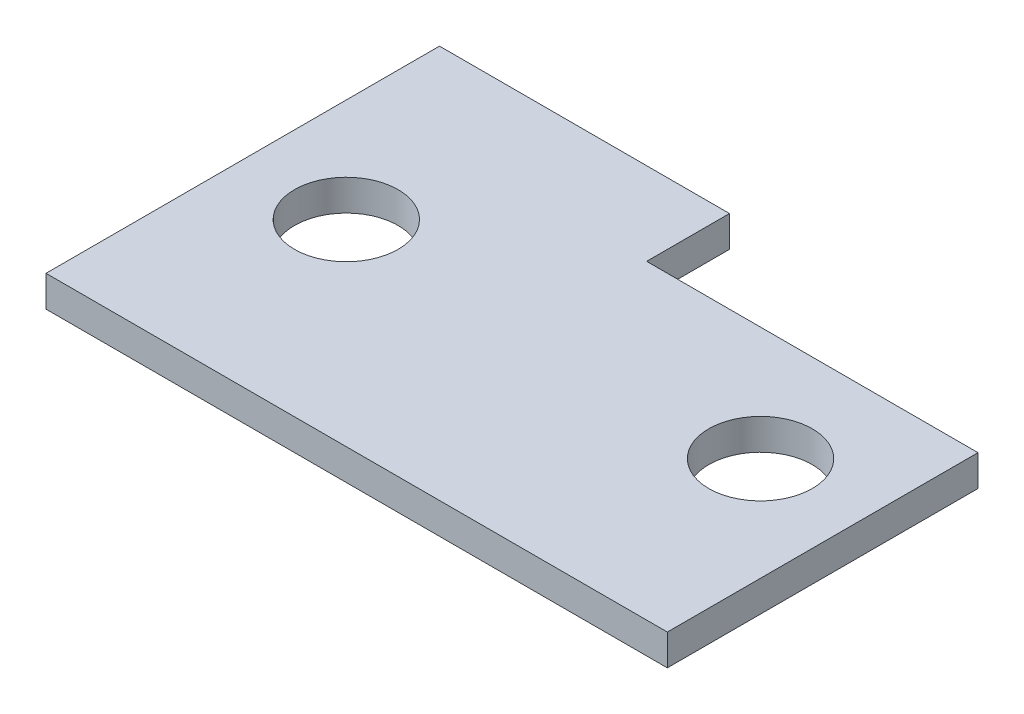
ISO-10303-21;
HEADER;
FILE_DESCRIPTION(('STEP AP214'),'2;1');
FILE_NAME('part.step','',(''),(''),'','','');
FILE_SCHEMA(('AUTOMOTIVE_DESIGN { 1 0 10303 214 1 1 1 1 }'));
ENDSEC;
DATA;
#1=APPLICATION_CONTEXT('core data for automotive mechanical design processes');
#2=APPLICATION_PROTOCOL_DEFINITION('international standard','automotive_design',2000,#1);
#3=PRODUCT_CONTEXT('',#1,'mechanical');
#4=PRODUCT('Part','Part','',(#3));
#5=PRODUCT_RELATED_PRODUCT_CATEGORY('part','',(#4));
#6=PRODUCT_DEFINITION_FORMATION('','',#4);
#7=PRODUCT_DEFINITION_CONTEXT('part definition',#1,'design');
#8=PRODUCT_DEFINITION('design','',#6,#7);
#9=PRODUCT_DEFINITION_SHAPE('','',#8);
#10=(LENGTH_UNIT() NAMED_UNIT(*) SI_UNIT(.MILLI.,.METRE.));
#11=(NAMED_UNIT(*) PLANE_ANGLE_UNIT() SI_UNIT($,.RADIAN.));
#12=(NAMED_UNIT(*) SI_UNIT($,.STERADIAN.) SOLID_ANGLE_UNIT());
#13=UNCERTAINTY_MEASURE_WITH_UNIT(LENGTH_MEASURE(1.E-05),#10,'distance_accuracy_value','');
#14=(GEOMETRIC_REPRESENTATION_CONTEXT(3) GLOBAL_UNCERTAINTY_ASSIGNED_CONTEXT((#13)) GLOBAL_UNIT_ASSIGNED_CONTEXT((#10,
#11,#12)) REPRESENTATION_CONTEXT('',''));
#15=CARTESIAN_POINT('',(0.,0.,0.));
#16=DIRECTION('',(0.,0.,1.));
#17=DIRECTION('',(1.,0.,0.));
#18=AXIS2_PLACEMENT_3D('',#15,#16,#17);
#19=CARTESIAN_POINT('',(68.1182371050919,7.74596669241483,2.));
#20=DIRECTION('',(0.,1.,0.));
#21=DIRECTION('',(0.,0.,1.));
#22=AXIS2_PLACEMENT_3D('',#19,#20,#21);
#23=PLANE('',#22);
#24=CARTESIAN_POINT('',(-20.,7.74596669241483,21.));
#25=DIRECTION('',(0.,1.,0.));
#26=DIRECTION('',(0.,0.,1.));
#27=AXIS2_PLACEMENT_3D('',#24,#25,#26);
#28=CIRCLE('',#27,5.);
#29=CARTESIAN_POINT('',(-20.,7.74596669241483,26.));
#30=VERTEX_POINT('',#29);
#31=EDGE_CURVE('E142',#30,#30,#28,.T.);
#32=ORIENTED_EDGE('',*,*,#31,.T.);
#33=EDGE_LOOP('',(#32));
#34=FACE_BOUND('',#33,.T.);
#35=CARTESIAN_POINT('',(20.,7.74596669241483,21.));
#36=DIRECTION('',(0.,1.,0.));
#37=DIRECTION('',(0.,0.,1.));
#38=AXIS2_PLACEMENT_3D('',#35,#36,#37);
#39=CIRCLE('',#38,5.);
#40=CARTESIAN_POINT('',(20.,7.74596669241483,26.));
#41=VERTEX_POINT('',#40);
#42=EDGE_CURVE('E136',#41,#41,#39,.T.);
#43=ORIENTED_EDGE('',*,*,#42,.T.);
#44=EDGE_LOOP('',(#43));
#45=FACE_BOUND('',#44,.T.);
#46=DIRECTION('',(0.,0.,1.));
#47=VECTOR('',#46,1.);
#48=CARTESIAN_POINT('',(-2.,7.74596669241483,2.));
#49=LINE('',#48,#47);
#50=CARTESIAN_POINT('',(-2.,7.74596669241483,2.));
#51=VERTEX_POINT('',#50);
#52=CARTESIAN_POINT('',(-2.,7.74596669241483,10.));
#53=VERTEX_POINT('',#52);
#54=EDGE_CURVE('E88',#51,#53,#49,.T.);
#55=ORIENTED_EDGE('',*,*,#54,.T.);
#56=DIRECTION('',(1.,0.,0.));
#57=VECTOR('',#56,1.);
#58=CARTESIAN_POINT('',(30.,7.74596669241483,10.));
#59=LINE('',#58,#57);
#60=CARTESIAN_POINT('',(30.,7.74596669241483,10.));
#61=VERTEX_POINT('',#60);
#62=EDGE_CURVE('E99',#53,#61,#59,.T.);
#63=ORIENTED_EDGE('',*,*,#62,.T.);
#64=DIRECTION('',(0.,0.,-1.));
#65=VECTOR('',#64,1.);
#66=CARTESIAN_POINT('',(30.,7.74596669241483,2.));
#67=LINE('',#66,#65);
#68=CARTESIAN_POINT('',(30.,7.74596669241484,40.));
#69=VERTEX_POINT('',#68);
#70=EDGE_CURVE('E44',#69,#61,#67,.T.);
#71=ORIENTED_EDGE('',*,*,#70,.F.);
#72=DIRECTION('',(-1.,0.,0.));
#73=VECTOR('',#72,1.);
#74=CARTESIAN_POINT('',(68.1182371050919,7.74596669241484,40.));
#75=LINE('',#74,#73);
#76=CARTESIAN_POINT('',(-30.,7.74596669241484,40.));
#77=VERTEX_POINT('',#76);
#78=EDGE_CURVE('E39',#69,#77,#75,.T.);
#79=ORIENTED_EDGE('',*,*,#78,.T.);
#80=DIRECTION('',(0.,0.,1.));
#81=VECTOR('',#80,1.);
#82=CARTESIAN_POINT('',(-30.,7.74596669241483,2.));
#83=LINE('',#82,#81);
#84=CARTESIAN_POINT('',(-30.,7.74596669241483,2.));
#85=VERTEX_POINT('',#84);
#86=EDGE_CURVE('E111',#85,#77,#83,.T.);
#87=ORIENTED_EDGE('',*,*,#86,.F.);
#88=DIRECTION('',(-1.,0.,0.));
#89=VECTOR('',#88,1.);
#90=CARTESIAN_POINT('',(68.1182371050919,7.74596669241483,2.));
#91=LINE('',#90,#89);
#92=EDGE_CURVE('E105',#51,#85,#91,.T.);
#93=ORIENTED_EDGE('',*,*,#92,.F.);
#94=EDGE_LOOP('',(#55,#63,#71,#79,#87,#93));
#95=FACE_BOUND('',#94,.T.);
#96=ADVANCED_FACE('F35',(#34,#45,#95),#23,.F.);
#97=CARTESIAN_POINT('',(68.1182371050919,7.74596669241483,2.));
#98=DIRECTION('',(0.,0.,1.));
#99=DIRECTION('',(1.,0.,0.));
#100=AXIS2_PLACEMENT_3D('',#97,#98,#99);
#101=PLANE('',#100);
#102=DIRECTION('',(-1.,0.,0.));
#103=VECTOR('',#102,1.);
#104=CARTESIAN_POINT('',(68.1182371050919,10.7459666924148,2.));
#105=LINE('',#104,#103);
#106=CARTESIAN_POINT('',(-2.,10.7459666924148,2.));
#107=VERTEX_POINT('',#106);
#108=CARTESIAN_POINT('',(-30.,10.7459666924148,2.));
#109=VERTEX_POINT('',#108);
#110=EDGE_CURVE('E107',#107,#109,#105,.T.);
#111=ORIENTED_EDGE('',*,*,#110,.F.);
#112=DIRECTION('',(0.,1.,0.));
#113=VECTOR('',#112,1.);
#114=CARTESIAN_POINT('',(-2.,7.74596669241483,2.));
#115=LINE('',#114,#113);
#116=EDGE_CURVE('E92',#51,#107,#115,.T.);
#117=ORIENTED_EDGE('',*,*,#116,.F.);
#118=ORIENTED_EDGE('',*,*,#92,.T.);
#119=DIRECTION('',(0.,-1.,0.));
#120=VECTOR('',#119,1.);
#121=CARTESIAN_POINT('',(-30.,7.74596669241483,2.));
#122=LINE('',#121,#120);
#123=EDGE_CURVE('E115',#109,#85,#122,.T.);
#124=ORIENTED_EDGE('',*,*,#123,.F.);
#125=EDGE_LOOP('',(#111,#117,#118,#124));
#126=FACE_BOUND('',#125,.T.);
#127=ADVANCED_FACE('F103',(#126),#101,.F.);
#128=CARTESIAN_POINT('',(68.1182371050919,10.7459666924148,2.));
#129=DIRECTION('',(0.,-1.,0.));
#130=DIRECTION('',(0.,0.,-1.));
#131=AXIS2_PLACEMENT_3D('',#128,#129,#130);
#132=PLANE('',#131);
#133=CARTESIAN_POINT('',(-20.,10.7459666924148,21.));
#134=DIRECTION('',(0.,1.,0.));
#135=DIRECTION('',(0.,0.,1.));
#136=AXIS2_PLACEMENT_3D('',#133,#134,#135);
#137=CIRCLE('',#136,5.);
#138=CARTESIAN_POINT('',(-20.,10.7459666924148,26.));
#139=VERTEX_POINT('',#138);
#140=EDGE_CURVE('E139',#139,#139,#137,.T.);
#141=ORIENTED_EDGE('',*,*,#140,.F.);
#142=EDGE_LOOP('',(#141));
#143=FACE_BOUND('',#142,.T.);
#144=CARTESIAN_POINT('',(20.,10.7459666924148,21.));
#145=DIRECTION('',(0.,1.,0.));
#146=DIRECTION('',(0.,0.,1.));
#147=AXIS2_PLACEMENT_3D('',#144,#145,#146);
#148=CIRCLE('',#147,5.);
#149=CARTESIAN_POINT('',(20.,10.7459666924148,26.));
#150=VERTEX_POINT('',#149);
#151=EDGE_CURVE('E133',#150,#150,#148,.T.);
#152=ORIENTED_EDGE('',*,*,#151,.F.);
#153=EDGE_LOOP('',(#152));
#154=FACE_BOUND('',#153,.T.);
#155=DIRECTION('',(0.,0.,1.));
#156=VECTOR('',#155,1.);
#157=CARTESIAN_POINT('',(30.,10.7459666924148,2.));
#158=LINE('',#157,#156);
#159=CARTESIAN_POINT('',(30.,10.7459666924148,10.));
#160=VERTEX_POINT('',#159);
#161=CARTESIAN_POINT('',(30.,10.7459666924148,40.));
#162=VERTEX_POINT('',#161);
#163=EDGE_CURVE('E11',#160,#162,#158,.T.);
#164=ORIENTED_EDGE('',*,*,#163,.F.);
#165=DIRECTION('',(1.,0.,0.));
#166=VECTOR('',#165,1.);
#167=CARTESIAN_POINT('',(30.,10.7459666924148,10.));
#168=LINE('',#167,#166);
#169=CARTESIAN_POINT('',(-2.,10.7459666924148,10.));
#170=VERTEX_POINT('',#169);
#171=EDGE_CURVE('E52',#170,#160,#168,.T.);
#172=ORIENTED_EDGE('',*,*,#171,.F.);
#173=DIRECTION('',(0.,0.,1.));
#174=VECTOR('',#173,1.);
#175=CARTESIAN_POINT('',(-2.,10.7459666924148,2.));
#176=LINE('',#175,#174);
#177=EDGE_CURVE('E144',#107,#170,#176,.T.);
#178=ORIENTED_EDGE('',*,*,#177,.F.);
#179=ORIENTED_EDGE('',*,*,#110,.T.);
#180=DIRECTION('',(0.,0.,-1.));
#181=VECTOR('',#180,1.);
#182=CARTESIAN_POINT('',(-30.,10.7459666924148,2.));
#183=LINE('',#182,#181);
#184=CARTESIAN_POINT('',(-30.,10.7459666924148,40.));
#185=VERTEX_POINT('',#184);
#186=EDGE_CURVE('E129',#185,#109,#183,.T.);
#187=ORIENTED_EDGE('',*,*,#186,.F.);
#188=DIRECTION('',(-1.,0.,0.));
#189=VECTOR('',#188,1.);
#190=CARTESIAN_POINT('',(68.1182371050919,10.7459666924148,40.));
#191=LINE('',#190,#189);
#192=EDGE_CURVE('E113',#162,#185,#191,.T.);
#193=ORIENTED_EDGE('',*,*,#192,.F.);
#194=EDGE_LOOP('',(#164,#172,#178,#179,#187,#193));
#195=FACE_BOUND('',#194,.T.);
#196=ADVANCED_FACE('F153',(#143,#154,#195),#132,.F.);
#197=CARTESIAN_POINT('',(68.1182371050919,7.74596669241484,40.));
#198=DIRECTION('',(0.,0.,-1.));
#199=DIRECTION('',(-1.,0.,0.));
#200=AXIS2_PLACEMENT_3D('',#197,#198,#199);
#201=PLANE('',#200);
#202=DIRECTION('',(0.,-1.,0.));
#203=VECTOR('',#202,1.);
#204=CARTESIAN_POINT('',(30.,7.74596669241484,40.));
#205=LINE('',#204,#203);
#206=EDGE_CURVE('E117',#162,#69,#205,.T.);
#207=ORIENTED_EDGE('',*,*,#206,.F.);
#208=ORIENTED_EDGE('',*,*,#192,.T.);
#209=DIRECTION('',(0.,1.,0.));
#210=VECTOR('',#209,1.);
#211=CARTESIAN_POINT('',(-30.,7.74596669241484,40.));
#212=LINE('',#211,#210);
#213=EDGE_CURVE('E127',#77,#185,#212,.T.);
#214=ORIENTED_EDGE('',*,*,#213,.F.);
#215=ORIENTED_EDGE('',*,*,#78,.F.);
#216=EDGE_LOOP('',(#207,#208,#214,#215));
#217=FACE_BOUND('',#216,.T.);
#218=ADVANCED_FACE('F155',(#217),#201,.F.);
#219=CARTESIAN_POINT('',(30.,0.,0.));
#220=DIRECTION('',(1.,0.,0.));
#221=DIRECTION('',(0.,0.,-1.));
#222=AXIS2_PLACEMENT_3D('',#219,#220,#221);
#223=PLANE('',#222);
#224=DIRECTION('',(0.,1.,0.));
#225=VECTOR('',#224,1.);
#226=CARTESIAN_POINT('',(30.,7.74596669241483,10.));
#227=LINE('',#226,#225);
#228=EDGE_CURVE('E132',#61,#160,#227,.T.);
#229=ORIENTED_EDGE('',*,*,#228,.T.);
#230=ORIENTED_EDGE('',*,*,#163,.T.);
#231=ORIENTED_EDGE('',*,*,#206,.T.);
#232=ORIENTED_EDGE('',*,*,#70,.T.);
#233=EDGE_LOOP('',(#229,#230,#231,#232));
#234=FACE_BOUND('',#233,.T.);
#235=ADVANCED_FACE('F37',(#234),#223,.T.);
#236=CARTESIAN_POINT('',(-30.,0.,0.));
#237=DIRECTION('',(1.,0.,0.));
#238=DIRECTION('',(0.,0.,-1.));
#239=AXIS2_PLACEMENT_3D('',#236,#237,#238);
#240=PLANE('',#239);
#241=ORIENTED_EDGE('',*,*,#86,.T.);
#242=ORIENTED_EDGE('',*,*,#213,.T.);
#243=ORIENTED_EDGE('',*,*,#186,.T.);
#244=ORIENTED_EDGE('',*,*,#123,.T.);
#245=EDGE_LOOP('',(#241,#242,#243,#244));
#246=FACE_BOUND('',#245,.T.);
#247=ADVANCED_FACE('F162',(#246),#240,.F.);
#248=CARTESIAN_POINT('',(30.,7.74596669241483,10.));
#249=DIRECTION('',(0.,0.,1.));
#250=DIRECTION('',(1.,0.,0.));
#251=AXIS2_PLACEMENT_3D('',#248,#249,#250);
#252=PLANE('',#251);
#253=ORIENTED_EDGE('',*,*,#171,.T.);
#254=ORIENTED_EDGE('',*,*,#228,.F.);
#255=ORIENTED_EDGE('',*,*,#62,.F.);
#256=DIRECTION('',(0.,1.,0.));
#257=VECTOR('',#256,1.);
#258=CARTESIAN_POINT('',(-2.,7.74596669241483,10.));
#259=LINE('',#258,#257);
#260=EDGE_CURVE('E94',#53,#170,#259,.T.);
#261=ORIENTED_EDGE('',*,*,#260,.T.);
#262=EDGE_LOOP('',(#253,#254,#255,#261));
#263=FACE_BOUND('',#262,.T.);
#264=ADVANCED_FACE('F150',(#263),#252,.F.);
#265=CARTESIAN_POINT('',(-2.,7.74596669241483,2.));
#266=DIRECTION('',(-1.,0.,0.));
#267=DIRECTION('',(0.,0.,1.));
#268=AXIS2_PLACEMENT_3D('',#265,#266,#267);
#269=PLANE('',#268);
#270=ORIENTED_EDGE('',*,*,#177,.T.);
#271=ORIENTED_EDGE('',*,*,#260,.F.);
#272=ORIENTED_EDGE('',*,*,#54,.F.);
#273=ORIENTED_EDGE('',*,*,#116,.T.);
#274=EDGE_LOOP('',(#270,#271,#272,#273));
#275=FACE_BOUND('',#274,.T.);
#276=ADVANCED_FACE('F91',(#275),#269,.F.);
#277=CARTESIAN_POINT('',(20.,7.74596669241483,21.));
#278=DIRECTION('',(0.,1.,0.));
#279=DIRECTION('',(0.,0.,1.));
#280=AXIS2_PLACEMENT_3D('',#277,#278,#279);
#281=CYLINDRICAL_SURFACE('',#280,5.);
#282=ORIENTED_EDGE('',*,*,#42,.F.);
#283=EDGE_LOOP('',(#282));
#284=FACE_BOUND('',#283,.T.);
#285=ORIENTED_EDGE('',*,*,#151,.T.);
#286=EDGE_LOOP('',(#285));
#287=FACE_BOUND('',#286,.T.);
#288=ADVANCED_FACE('F176',(#284,#287),#281,.F.);
#289=CARTESIAN_POINT('',(-20.,7.74596669241483,21.));
#290=DIRECTION('',(0.,1.,0.));
#291=DIRECTION('',(0.,0.,1.));
#292=AXIS2_PLACEMENT_3D('',#289,#290,#291);
#293=CYLINDRICAL_SURFACE('',#292,5.);
#294=ORIENTED_EDGE('',*,*,#31,.F.);
#295=EDGE_LOOP('',(#294));
#296=FACE_BOUND('',#295,.T.);
#297=ORIENTED_EDGE('',*,*,#140,.T.);
#298=EDGE_LOOP('',(#297));
#299=FACE_BOUND('',#298,.T.);
#300=ADVANCED_FACE('F179',(#296,#299),#293,.F.);
#301=CLOSED_SHELL('',(#96,#127,#196,#218,#235,#247,#264,#276,#288,#300));
#302=MANIFOLD_SOLID_BREP('B2',#301);
#303=ADVANCED_BREP_SHAPE_REPRESENTATION('',(#18,#302),#14);
#304=SHAPE_DEFINITION_REPRESENTATION(#9,#303);
ENDSEC;
END-ISO-10303-21;
